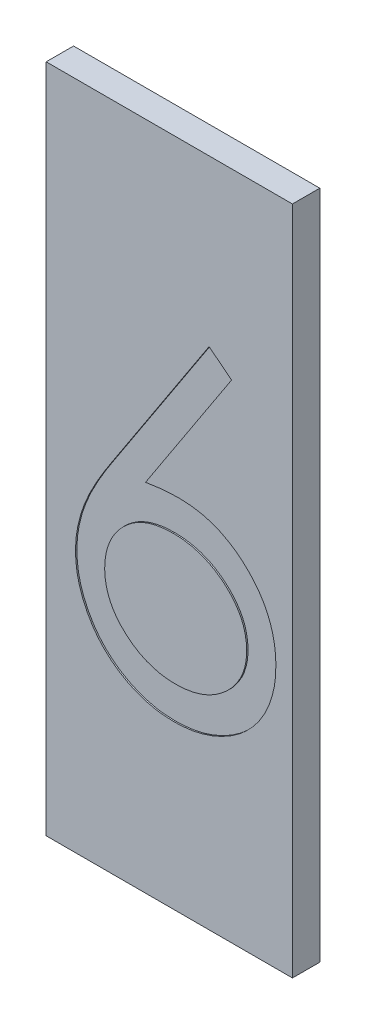
ISO-10303-21;
HEADER;
FILE_DESCRIPTION(('STEP AP214'),'2;1');
FILE_NAME('part.step','',(''),(''),'','','');
FILE_SCHEMA(('AUTOMOTIVE_DESIGN { 1 0 10303 214 1 1 1 1 }'));
ENDSEC;
DATA;
#1=APPLICATION_CONTEXT('core data for automotive mechanical design processes');
#2=APPLICATION_PROTOCOL_DEFINITION('international standard','automotive_design',2000,#1);
#3=PRODUCT_CONTEXT('',#1,'mechanical');
#4=PRODUCT('Part','Part','',(#3));
#5=PRODUCT_RELATED_PRODUCT_CATEGORY('part','',(#4));
#6=PRODUCT_DEFINITION_FORMATION('','',#4);
#7=PRODUCT_DEFINITION_CONTEXT('part definition',#1,'design');
#8=PRODUCT_DEFINITION('design','',#6,#7);
#9=PRODUCT_DEFINITION_SHAPE('','',#8);
#10=(LENGTH_UNIT() NAMED_UNIT(*) SI_UNIT(.MILLI.,.METRE.));
#11=(NAMED_UNIT(*) PLANE_ANGLE_UNIT() SI_UNIT($,.RADIAN.));
#12=(NAMED_UNIT(*) SI_UNIT($,.STERADIAN.) SOLID_ANGLE_UNIT());
#13=UNCERTAINTY_MEASURE_WITH_UNIT(LENGTH_MEASURE(1.E-05),#10,'distance_accuracy_value','');
#14=(GEOMETRIC_REPRESENTATION_CONTEXT(3) GLOBAL_UNCERTAINTY_ASSIGNED_CONTEXT((#13)) GLOBAL_UNIT_ASSIGNED_CONTEXT((#10,
#11,#12)) REPRESENTATION_CONTEXT('',''));
#15=CARTESIAN_POINT('',(0.,0.,0.));
#16=DIRECTION('',(0.,0.,1.));
#17=DIRECTION('',(1.,0.,0.));
#18=AXIS2_PLACEMENT_3D('',#15,#16,#17);
#19=CARTESIAN_POINT('',(0.,0.,2.));
#20=DIRECTION('',(0.,0.,1.));
#21=DIRECTION('',(1.,0.,0.));
#22=AXIS2_PLACEMENT_3D('',#19,#20,#21);
#23=PLANE('',#22);
#24=DIRECTION('',(0.,-1.,0.));
#25=VECTOR('',#24,1.);
#26=CARTESIAN_POINT('',(0.,0.,2.));
#27=LINE('',#26,#25);
#28=CARTESIAN_POINT('',(0.,49.,2.));
#29=VERTEX_POINT('',#28);
#30=CARTESIAN_POINT('',(0.,0.,2.));
#31=VERTEX_POINT('',#30);
#32=EDGE_CURVE('E282',#29,#31,#27,.T.);
#33=ORIENTED_EDGE('',*,*,#32,.T.);
#34=DIRECTION('',(1.,0.,0.));
#35=VECTOR('',#34,1.);
#36=CARTESIAN_POINT('',(18.,0.,2.));
#37=LINE('',#36,#35);
#38=CARTESIAN_POINT('',(18.,0.,2.));
#39=VERTEX_POINT('',#38);
#40=EDGE_CURVE('E285',#31,#39,#37,.T.);
#41=ORIENTED_EDGE('',*,*,#40,.T.);
#42=DIRECTION('',(0.,1.,0.));
#43=VECTOR('',#42,1.);
#44=CARTESIAN_POINT('',(18.,0.,2.));
#45=LINE('',#44,#43);
#46=CARTESIAN_POINT('',(18.,49.,2.));
#47=VERTEX_POINT('',#46);
#48=EDGE_CURVE('E288',#39,#47,#45,.T.);
#49=ORIENTED_EDGE('',*,*,#48,.T.);
#50=DIRECTION('',(-1.,0.,0.));
#51=VECTOR('',#50,1.);
#52=CARTESIAN_POINT('',(18.,49.,2.));
#53=LINE('',#52,#51);
#54=EDGE_CURVE('E290',#47,#29,#53,.T.);
#55=ORIENTED_EDGE('',*,*,#54,.T.);
#56=EDGE_LOOP('',(#33,#41,#49,#55));
#57=FACE_BOUND('',#56,.T.);
#58=CARTESIAN_POINT('',(2.13701923076923,19.1400240384615,2.));
#59=CARTESIAN_POINT('',(2.14505727626029,19.385255934943,2.));
#60=CARTESIAN_POINT('',(2.1614694293508,19.8859726119271,2.));
#61=CARTESIAN_POINT('',(2.27606463861702,20.6443260877571,2.));
#62=CARTESIAN_POINT('',(2.46020190312487,21.4202807687899,2.));
#63=CARTESIAN_POINT('',(2.66641982920136,22.0785548359355,2.));
#64=CARTESIAN_POINT('',(2.88430835468672,22.6178162621249,2.));
#65=CARTESIAN_POINT('',(3.06564081152372,23.052588225122,2.));
#66=CARTESIAN_POINT('',(3.29134246315642,23.4999983840939,2.));
#67=CARTESIAN_POINT('',(3.53200778878687,23.9753886574602,2.));
#68=CARTESIAN_POINT('',(3.8093000576511,24.466507404859,2.));
#69=CARTESIAN_POINT('',(4.1108047436682,24.9815627274443,2.));
#70=CARTESIAN_POINT('',(4.44485772572192,25.5123632710015,2.));
#71=CARTESIAN_POINT('',(4.67903776154775,25.8725728850918,2.));
#72=CARTESIAN_POINT('',(4.79875300480769,26.0567157451923,2.));
#73=B_SPLINE_CURVE_WITH_KNOTS('',3,(#58,#59,#60,#61,#62,#63,#64,#65,#66,#67,#68,#69,#70,#71,
#72),.UNSPECIFIED.,.F.,.F.,(4,1,1,1,1,1,1,1,1,1,1,1,4),(0.,0.0978181896147144,0.199726053401827,
0.305276357477941,0.415811490538292,0.47447223114356,0.537273879776098,0.603657420559656,
0.674298863090126,0.749834485316229,0.828598476757102,0.912377778157781,1.),.UNSPECIFIED.);
#74=CARTESIAN_POINT('',(2.13701923076923,19.1400240384615,2.));
#75=VERTEX_POINT('',#74);
#76=CARTESIAN_POINT('',(4.79875300480769,26.0567157451923,2.));
#77=VERTEX_POINT('',#76);
#78=EDGE_CURVE('E254',#75,#77,#73,.T.);
#79=ORIENTED_EDGE('',*,*,#78,.T.);
#80=DIRECTION('',(0.547387929885783,0.836878996160949,0.));
#81=VECTOR('',#80,1.);
#82=CARTESIAN_POINT('',(4.79875300480769,26.0567157451923,2.));
#83=LINE('',#82,#81);
#84=CARTESIAN_POINT('',(11.90625,36.9230769230769,2.));
#85=VERTEX_POINT('',#84);
#86=EDGE_CURVE('E48',#77,#85,#83,.T.);
#87=ORIENTED_EDGE('',*,*,#86,.T.);
#88=DIRECTION('',(0.786397428722927,-0.617720878793949,0.));
#89=VECTOR('',#88,1.);
#90=CARTESIAN_POINT('',(11.90625,36.9230769230769,2.));
#91=LINE('',#90,#89);
#92=CARTESIAN_POINT('',(13.5519456129808,35.63037109375,2.));
#93=VERTEX_POINT('',#92);
#94=EDGE_CURVE('E219',#85,#93,#91,.T.);
#95=ORIENTED_EDGE('',*,*,#94,.T.);
#96=DIRECTION('',(-0.547305260353809,-0.836933063027773,0.));
#97=VECTOR('',#96,1.);
#98=CARTESIAN_POINT('',(13.5519456129808,35.63037109375,2.));
#99=LINE('',#98,#97);
#100=CARTESIAN_POINT('',(7.26014122596154,26.0090144230769,2.));
#101=VERTEX_POINT('',#100);
#102=EDGE_CURVE('E222',#93,#101,#99,.T.);
#103=ORIENTED_EDGE('',*,*,#102,.T.);
#104=CARTESIAN_POINT('',(7.26014122596154,26.0090144230769,2.));
#105=CARTESIAN_POINT('',(7.67903900329456,26.0757837250237,2.));
#106=CARTESIAN_POINT('',(8.49614648118071,26.206024797825,2.));
#107=CARTESIAN_POINT('',(9.32322875506985,26.2275101052509,2.));
#108=CARTESIAN_POINT('',(9.72629957932693,26.2379807692308,2.));
#109=B_SPLINE_CURVE_WITH_KNOTS('',3,(#104,#105,#106,#107,#108),.UNSPECIFIED.,.F.,.F.,(4,1,4),
(0.,0.512659336341781,1.),.UNSPECIFIED.);
#110=CARTESIAN_POINT('',(9.72629957932693,26.2379807692308,2.));
#111=VERTEX_POINT('',#110);
#112=EDGE_CURVE('E225',#101,#111,#109,.T.);
#113=ORIENTED_EDGE('',*,*,#112,.T.);
#114=CARTESIAN_POINT('',(9.72629957932692,26.2379807692308,2.));
#115=CARTESIAN_POINT('',(9.9683195990358,26.2314757950149,2.));
#116=CARTESIAN_POINT('',(10.4447288057093,26.2186709468484,2.));
#117=CARTESIAN_POINT('',(11.1441822276431,26.1201290341057,2.));
#118=CARTESIAN_POINT('',(11.8162998098892,25.9648367547682,2.));
#119=CARTESIAN_POINT('',(12.458295778984,25.7384665848349,2.));
#120=CARTESIAN_POINT('',(13.0724744591357,25.4492987810486,2.));
#121=CARTESIAN_POINT('',(13.6623604040884,25.1027325386045,2.));
#122=CARTESIAN_POINT('',(14.2168651514182,24.6808724633202,2.));
#123=CARTESIAN_POINT('',(14.7431294242706,24.2096233891478,2.));
#124=CARTESIAN_POINT('',(15.2209244976048,23.6876739053505,2.));
#125=CARTESIAN_POINT('',(15.6439437327372,23.1338540966897,2.));
#126=CARTESIAN_POINT('',(15.9992724407854,22.5487409598984,2.));
#127=CARTESIAN_POINT('',(16.2875664431989,21.9326308541734,2.));
#128=CARTESIAN_POINT('',(16.5114371350881,21.2864734989491,2.));
#129=CARTESIAN_POINT('',(16.6746387915454,20.6110956213583,2.));
#130=CARTESIAN_POINT('',(16.7711106641233,19.9060315030314,2.));
#131=CARTESIAN_POINT('',(16.7842108777385,19.4265282034526,2.));
#132=CARTESIAN_POINT('',(16.7908653846154,19.1829552283654,2.));
#133=B_SPLINE_CURVE_WITH_KNOTS('',3,(#114,#115,#116,#117,#118,#119,#120,#121,#122,#123,#124,
#125,#126,#127,#128,#129,#130,#131,#132),.UNSPECIFIED.,.F.,.F.,(4,1,1,1,1,1,1,1,1,1,1,1,1,1,1,1,
4),(0.,0.0652308037420294,0.128404896003223,0.190067071596478,0.25094336576828,
0.311545832852143,0.372862802156829,0.435023673856238,0.499071724707043,0.563091075049662,
0.625510106330375,0.686680035929649,0.747282503013512,0.808563495215959,0.870742103515985,
0.934340951505912,1.),.UNSPECIFIED.);
#134=CARTESIAN_POINT('',(16.7908653846154,19.1829552283654,2.));
#135=VERTEX_POINT('',#134);
#136=EDGE_CURVE('E230',#111,#135,#133,.T.);
#137=ORIENTED_EDGE('',*,*,#136,.T.);
#138=CARTESIAN_POINT('',(16.7908653846154,19.1829552283654,2.));
#139=CARTESIAN_POINT('',(16.7811831888853,18.8497183140129,2.));
#140=CARTESIAN_POINT('',(16.762130919053,18.1939869295885,2.));
#141=CARTESIAN_POINT('',(16.5722854496981,17.2389239806579,2.));
#142=CARTESIAN_POINT('',(16.2772850094877,16.3290652589061,2.));
#143=CARTESIAN_POINT('',(15.8556164680306,15.4789374322748,2.));
#144=CARTESIAN_POINT('',(15.3318613266591,14.6897056642524,2.));
#145=CARTESIAN_POINT('',(14.6931584194015,13.9903974084369,2.));
#146=CARTESIAN_POINT('',(13.9621589719857,13.3667137616876,2.));
#147=CARTESIAN_POINT('',(13.1356148629397,12.8451749774337,2.));
#148=CARTESIAN_POINT('',(12.246095767791,12.4192506482241,2.));
#149=CARTESIAN_POINT('',(11.3116116425255,12.1133264119102,2.));
#150=CARTESIAN_POINT('',(10.3412376647535,11.9249799505184,2.));
#151=CARTESIAN_POINT('',(9.68262059923948,11.9013674573714,2.));
#152=CARTESIAN_POINT('',(9.34945913461539,11.8894230769231,2.));
#153=B_SPLINE_CURVE_WITH_KNOTS('',3,(#138,#139,#140,#141,#142,#143,#144,#145,#146,#147,#148,
#149,#150,#151,#152),.UNSPECIFIED.,.F.,.F.,(4,1,1,1,1,1,1,1,1,1,1,1,4),(0.,0.0859479431441278,
0.169125211880691,0.25039910718605,0.332289736138836,0.413364287915881,0.494172283371189,
0.576021735386637,0.660756969254007,0.745783125913743,0.830043592975224,0.914027545820683,1.),.UNSPECIFIED.);
#154=CARTESIAN_POINT('',(9.34945913461539,11.8894230769231,2.));
#155=VERTEX_POINT('',#154);
#156=EDGE_CURVE('E238',#135,#155,#153,.T.);
#157=ORIENTED_EDGE('',*,*,#156,.T.);
#158=CARTESIAN_POINT('',(9.34945913461539,11.8894230769231,2.));
#159=CARTESIAN_POINT('',(9.02903336767536,11.8998203338581,2.));
#160=CARTESIAN_POINT('',(8.39432602551729,11.9204154794294,2.));
#161=CARTESIAN_POINT('',(7.46065290757996,12.1038801638961,2.));
#162=CARTESIAN_POINT('',(6.56351345031093,12.4012445595191,2.));
#163=CARTESIAN_POINT('',(5.70919319806236,12.8109167046056,2.));
#164=CARTESIAN_POINT('',(4.91779759939207,13.3283819439784,2.));
#165=CARTESIAN_POINT('',(4.20977960866337,13.9513324502154,2.));
#166=CARTESIAN_POINT('',(3.58866949961299,14.6664522036546,2.));
#167=CARTESIAN_POINT('',(3.07177073935221,15.4736302806295,2.));
#168=CARTESIAN_POINT('',(2.6617961523542,16.3410173129363,2.));
#169=CARTESIAN_POINT('',(2.35434326897368,17.2454647519438,2.));
#170=CARTESIAN_POINT('',(2.17475454267769,18.1836771276141,2.));
#171=CARTESIAN_POINT('',(2.14965918271041,18.8196827352936,2.));
#172=CARTESIAN_POINT('',(2.13701923076923,19.1400240384615,2.));
#173=B_SPLINE_CURVE_WITH_KNOTS('',3,(#158,#159,#160,#161,#162,#163,#164,#165,#166,#167,#168,
#169,#170,#171,#172),.UNSPECIFIED.,.F.,.F.,(4,1,1,1,1,1,1,1,1,1,1,1,4),(0.,0.0843347219926269,
0.167052318416074,0.249566077240966,0.332740481801846,0.415914886362727,0.497828009539996,
0.580372588608051,0.664600121056503,0.749466693112617,0.832510233940141,0.915639281668174,1.),.UNSPECIFIED.);
#174=EDGE_CURVE('E246',#155,#75,#173,.T.);
#175=ORIENTED_EDGE('',*,*,#174,.T.);
#176=EDGE_LOOP('',(#79,#87,#95,#103,#113,#137,#157,#175));
#177=FACE_BOUND('',#176,.T.);
#178=ADVANCED_FACE('F33',(#57,#177),#23,.T.);
#179=CARTESIAN_POINT('',(0.,0.,2.));
#180=DIRECTION('',(1.,0.,0.));
#181=DIRECTION('',(0.,0.,-1.));
#182=AXIS2_PLACEMENT_3D('',#179,#180,#181);
#183=PLANE('',#182);
#184=DIRECTION('',(0.,-1.,0.));
#185=VECTOR('',#184,1.);
#186=CARTESIAN_POINT('',(0.,0.,0.));
#187=LINE('',#186,#185);
#188=CARTESIAN_POINT('',(0.,49.,0.));
#189=VERTEX_POINT('',#188);
#190=CARTESIAN_POINT('',(0.,0.,0.));
#191=VERTEX_POINT('',#190);
#192=EDGE_CURVE('E281',#189,#191,#187,.T.);
#193=ORIENTED_EDGE('',*,*,#192,.T.);
#194=DIRECTION('',(0.,0.,-1.));
#195=VECTOR('',#194,1.);
#196=CARTESIAN_POINT('',(0.,0.,2.));
#197=LINE('',#196,#195);
#198=EDGE_CURVE('E11',#31,#191,#197,.T.);
#199=ORIENTED_EDGE('',*,*,#198,.F.);
#200=ORIENTED_EDGE('',*,*,#32,.F.);
#201=DIRECTION('',(0.,0.,-1.));
#202=VECTOR('',#201,1.);
#203=CARTESIAN_POINT('',(0.,49.,2.));
#204=LINE('',#203,#202);
#205=EDGE_CURVE('E292',#29,#189,#204,.T.);
#206=ORIENTED_EDGE('',*,*,#205,.T.);
#207=EDGE_LOOP('',(#193,#199,#200,#206));
#208=FACE_BOUND('',#207,.T.);
#209=ADVANCED_FACE('F35',(#208),#183,.F.);
#210=CARTESIAN_POINT('',(18.,0.,2.));
#211=DIRECTION('',(0.,1.,0.));
#212=DIRECTION('',(0.,0.,1.));
#213=AXIS2_PLACEMENT_3D('',#210,#211,#212);
#214=PLANE('',#213);
#215=DIRECTION('',(1.,0.,0.));
#216=VECTOR('',#215,1.);
#217=CARTESIAN_POINT('',(18.,0.,0.));
#218=LINE('',#217,#216);
#219=CARTESIAN_POINT('',(18.,0.,0.));
#220=VERTEX_POINT('',#219);
#221=EDGE_CURVE('E295',#191,#220,#218,.T.);
#222=ORIENTED_EDGE('',*,*,#221,.T.);
#223=DIRECTION('',(0.,0.,-1.));
#224=VECTOR('',#223,1.);
#225=CARTESIAN_POINT('',(18.,0.,2.));
#226=LINE('',#225,#224);
#227=EDGE_CURVE('E41',#39,#220,#226,.T.);
#228=ORIENTED_EDGE('',*,*,#227,.F.);
#229=ORIENTED_EDGE('',*,*,#40,.F.);
#230=ORIENTED_EDGE('',*,*,#198,.T.);
#231=EDGE_LOOP('',(#222,#228,#229,#230));
#232=FACE_BOUND('',#231,.T.);
#233=ADVANCED_FACE('F325',(#232),#214,.F.);
#234=CARTESIAN_POINT('',(18.,0.,2.));
#235=DIRECTION('',(-1.,0.,0.));
#236=DIRECTION('',(0.,0.,1.));
#237=AXIS2_PLACEMENT_3D('',#234,#235,#236);
#238=PLANE('',#237);
#239=DIRECTION('',(0.,1.,0.));
#240=VECTOR('',#239,1.);
#241=CARTESIAN_POINT('',(18.,0.,0.));
#242=LINE('',#241,#240);
#243=CARTESIAN_POINT('',(18.,49.,0.));
#244=VERTEX_POINT('',#243);
#245=EDGE_CURVE('E297',#220,#244,#242,.T.);
#246=ORIENTED_EDGE('',*,*,#245,.T.);
#247=DIRECTION('',(0.,0.,-1.));
#248=VECTOR('',#247,1.);
#249=CARTESIAN_POINT('',(18.,49.,2.));
#250=LINE('',#249,#248);
#251=EDGE_CURVE('E302',#47,#244,#250,.T.);
#252=ORIENTED_EDGE('',*,*,#251,.F.);
#253=ORIENTED_EDGE('',*,*,#48,.F.);
#254=ORIENTED_EDGE('',*,*,#227,.T.);
#255=EDGE_LOOP('',(#246,#252,#253,#254));
#256=FACE_BOUND('',#255,.T.);
#257=ADVANCED_FACE('F309',(#256),#238,.F.);
#258=CARTESIAN_POINT('',(18.,49.,2.));
#259=DIRECTION('',(0.,-1.,0.));
#260=DIRECTION('',(0.,0.,-1.));
#261=AXIS2_PLACEMENT_3D('',#258,#259,#260);
#262=PLANE('',#261);
#263=DIRECTION('',(-1.,0.,0.));
#264=VECTOR('',#263,1.);
#265=CARTESIAN_POINT('',(18.,49.,0.));
#266=LINE('',#265,#264);
#267=EDGE_CURVE('E286',#244,#189,#266,.T.);
#268=ORIENTED_EDGE('',*,*,#267,.T.);
#269=ORIENTED_EDGE('',*,*,#205,.F.);
#270=ORIENTED_EDGE('',*,*,#54,.F.);
#271=ORIENTED_EDGE('',*,*,#251,.T.);
#272=EDGE_LOOP('',(#268,#269,#270,#271));
#273=FACE_BOUND('',#272,.T.);
#274=ADVANCED_FACE('F318',(#273),#262,.F.);
#275=CARTESIAN_POINT('',(0.,0.,0.));
#276=DIRECTION('',(0.,0.,1.));
#277=DIRECTION('',(1.,0.,0.));
#278=AXIS2_PLACEMENT_3D('',#275,#276,#277);
#279=PLANE('',#278);
#280=ORIENTED_EDGE('',*,*,#192,.F.);
#281=ORIENTED_EDGE('',*,*,#267,.F.);
#282=ORIENTED_EDGE('',*,*,#245,.F.);
#283=ORIENTED_EDGE('',*,*,#221,.F.);
#284=EDGE_LOOP('',(#280,#281,#282,#283));
#285=FACE_BOUND('',#284,.T.);
#286=ADVANCED_FACE('F315',(#285),#279,.F.);
#287=CARTESIAN_POINT('',(4.79875300480769,26.0567157451923,1.9));
#288=DIRECTION('',(0.836878996160949,-0.547387929885783,0.));
#289=DIRECTION('',(0.547387929885783,0.836878996160949,0.));
#290=AXIS2_PLACEMENT_3D('',#287,#288,#289);
#291=PLANE('',#290);
#292=ORIENTED_EDGE('',*,*,#86,.F.);
#293=DIRECTION('',(0.,0.,1.));
#294=VECTOR('',#293,1.);
#295=CARTESIAN_POINT('',(4.79875300480769,26.0567157451923,1.9));
#296=LINE('',#295,#294);
#297=CARTESIAN_POINT('',(4.79875300480769,26.0567157451923,1.9));
#298=VERTEX_POINT('',#297);
#299=EDGE_CURVE('E209',#298,#77,#296,.T.);
#300=ORIENTED_EDGE('',*,*,#299,.F.);
#301=DIRECTION('',(0.547387929885783,0.836878996160949,0.));
#302=VECTOR('',#301,1.);
#303=CARTESIAN_POINT('',(4.79875300480769,26.0567157451923,1.9));
#304=LINE('',#303,#302);
#305=CARTESIAN_POINT('',(11.90625,36.9230769230769,1.9));
#306=VERTEX_POINT('',#305);
#307=EDGE_CURVE('E262',#298,#306,#304,.T.);
#308=ORIENTED_EDGE('',*,*,#307,.T.);
#309=DIRECTION('',(0.,0.,1.));
#310=VECTOR('',#309,1.);
#311=CARTESIAN_POINT('',(11.90625,36.9230769230769,1.9));
#312=LINE('',#311,#310);
#313=EDGE_CURVE('E279',#306,#85,#312,.T.);
#314=ORIENTED_EDGE('',*,*,#313,.T.);
#315=EDGE_LOOP('',(#292,#300,#308,#314));
#316=FACE_BOUND('',#315,.T.);
#317=ADVANCED_FACE('F411',(#316),#291,.T.);
#318=CARTESIAN_POINT('',(11.90625,36.9230769230769,1.9));
#319=DIRECTION('',(-0.617720878793949,-0.786397428722927,0.));
#320=DIRECTION('',(0.786397428722927,-0.617720878793949,0.));
#321=AXIS2_PLACEMENT_3D('',#318,#319,#320);
#322=PLANE('',#321);
#323=ORIENTED_EDGE('',*,*,#94,.F.);
#324=ORIENTED_EDGE('',*,*,#313,.F.);
#325=DIRECTION('',(0.786397428722927,-0.617720878793949,0.));
#326=VECTOR('',#325,1.);
#327=CARTESIAN_POINT('',(11.90625,36.9230769230769,1.9));
#328=LINE('',#327,#326);
#329=CARTESIAN_POINT('',(13.5519456129808,35.63037109375,1.9));
#330=VERTEX_POINT('',#329);
#331=EDGE_CURVE('E382',#306,#330,#328,.T.);
#332=ORIENTED_EDGE('',*,*,#331,.T.);
#333=DIRECTION('',(0.,0.,1.));
#334=VECTOR('',#333,1.);
#335=CARTESIAN_POINT('',(13.5519456129808,35.63037109375,1.9));
#336=LINE('',#335,#334);
#337=EDGE_CURVE('E277',#330,#93,#336,.T.);
#338=ORIENTED_EDGE('',*,*,#337,.T.);
#339=EDGE_LOOP('',(#323,#324,#332,#338));
#340=FACE_BOUND('',#339,.T.);
#341=ADVANCED_FACE('F408',(#340),#322,.T.);
#342=CARTESIAN_POINT('',(13.5519456129808,35.63037109375,1.9));
#343=DIRECTION('',(-0.836933063027773,0.547305260353809,0.));
#344=DIRECTION('',(-0.547305260353809,-0.836933063027773,0.));
#345=AXIS2_PLACEMENT_3D('',#342,#343,#344);
#346=PLANE('',#345);
#347=ORIENTED_EDGE('',*,*,#102,.F.);
#348=ORIENTED_EDGE('',*,*,#337,.F.);
#349=DIRECTION('',(-0.547305260353809,-0.836933063027773,0.));
#350=VECTOR('',#349,1.);
#351=CARTESIAN_POINT('',(13.5519456129808,35.63037109375,1.9));
#352=LINE('',#351,#350);
#353=CARTESIAN_POINT('',(7.26014122596154,26.0090144230769,1.9));
#354=VERTEX_POINT('',#353);
#355=EDGE_CURVE('E384',#330,#354,#352,.T.);
#356=ORIENTED_EDGE('',*,*,#355,.T.);
#357=DIRECTION('',(0.,0.,1.));
#358=VECTOR('',#357,1.);
#359=CARTESIAN_POINT('',(7.26014122596154,26.0090144230769,1.9));
#360=LINE('',#359,#358);
#361=EDGE_CURVE('E275',#354,#101,#360,.T.);
#362=ORIENTED_EDGE('',*,*,#361,.T.);
#363=EDGE_LOOP('',(#347,#348,#356,#362));
#364=FACE_BOUND('',#363,.T.);
#365=ADVANCED_FACE('F404',(#364),#346,.T.);
#366=CARTESIAN_POINT('',(7.26014122596154,26.0090144230769,1.9));
#367=CARTESIAN_POINT('',(7.67903900329456,26.0757837250237,1.9));
#368=CARTESIAN_POINT('',(8.49614648118071,26.206024797825,1.9));
#369=CARTESIAN_POINT('',(9.32322875506985,26.2275101052509,1.9));
#370=CARTESIAN_POINT('',(9.72629957932693,26.2379807692308,1.9));
#371=B_SPLINE_CURVE_WITH_KNOTS('',3,(#366,#367,#368,#369,#370),.UNSPECIFIED.,.F.,.F.,(4,1,4),
(0.,0.512659336341781,1.),.UNSPECIFIED.);
#372=DIRECTION('',(0.,0.,1.));
#373=VECTOR('',#372,1.);
#374=SURFACE_OF_LINEAR_EXTRUSION('',#371,#373);
#375=ORIENTED_EDGE('',*,*,#112,.F.);
#376=ORIENTED_EDGE('',*,*,#361,.F.);
#377=CARTESIAN_POINT('',(9.72629957932693,26.2379807692308,1.9));
#378=VERTEX_POINT('',#377);
#379=EDGE_CURVE('E386',#354,#378,#371,.T.);
#380=ORIENTED_EDGE('',*,*,#379,.T.);
#381=DIRECTION('',(0.,0.,1.));
#382=VECTOR('',#381,1.);
#383=CARTESIAN_POINT('',(9.72629957932693,26.2379807692308,1.9));
#384=LINE('',#383,#382);
#385=EDGE_CURVE('E273',#378,#111,#384,.T.);
#386=ORIENTED_EDGE('',*,*,#385,.T.);
#387=EDGE_LOOP('',(#375,#376,#380,#386));
#388=FACE_BOUND('',#387,.T.);
#389=ADVANCED_FACE('F399',(#388),#374,.T.);
#390=CARTESIAN_POINT('',(9.72629957932692,26.2379807692308,1.9));
#391=CARTESIAN_POINT('',(9.9683195990358,26.2314757950149,1.9));
#392=CARTESIAN_POINT('',(10.4447288057093,26.2186709468484,1.9));
#393=CARTESIAN_POINT('',(11.1441822276431,26.1201290341057,1.9));
#394=CARTESIAN_POINT('',(11.8162998098892,25.9648367547682,1.9));
#395=CARTESIAN_POINT('',(12.458295778984,25.7384665848349,1.9));
#396=CARTESIAN_POINT('',(13.0724744591357,25.4492987810486,1.9));
#397=CARTESIAN_POINT('',(13.6623604040884,25.1027325386045,1.9));
#398=CARTESIAN_POINT('',(14.2168651514182,24.6808724633202,1.9));
#399=CARTESIAN_POINT('',(14.7431294242706,24.2096233891478,1.9));
#400=CARTESIAN_POINT('',(15.2209244976048,23.6876739053505,1.9));
#401=CARTESIAN_POINT('',(15.6439437327372,23.1338540966897,1.9));
#402=CARTESIAN_POINT('',(15.9992724407854,22.5487409598984,1.9));
#403=CARTESIAN_POINT('',(16.2875664431989,21.9326308541734,1.9));
#404=CARTESIAN_POINT('',(16.5114371350881,21.2864734989491,1.9));
#405=CARTESIAN_POINT('',(16.6746387915454,20.6110956213583,1.9));
#406=CARTESIAN_POINT('',(16.7711106641233,19.9060315030314,1.9));
#407=CARTESIAN_POINT('',(16.7842108777385,19.4265282034526,1.9));
#408=CARTESIAN_POINT('',(16.7908653846154,19.1829552283654,1.9));
#409=B_SPLINE_CURVE_WITH_KNOTS('',3,(#390,#391,#392,#393,#394,#395,#396,#397,#398,#399,#400,
#401,#402,#403,#404,#405,#406,#407,#408),.UNSPECIFIED.,.F.,.F.,(4,1,1,1,1,1,1,1,1,1,1,1,1,1,1,1,
4),(0.,0.0652308037420294,0.128404896003223,0.190067071596478,0.25094336576828,
0.311545832852143,0.372862802156829,0.435023673856238,0.499071724707043,0.563091075049662,
0.625510106330375,0.686680035929649,0.747282503013512,0.808563495215959,0.870742103515985,
0.934340951505912,1.),.UNSPECIFIED.);
#410=DIRECTION('',(0.,0.,1.));
#411=VECTOR('',#410,1.);
#412=SURFACE_OF_LINEAR_EXTRUSION('',#409,#411);
#413=ORIENTED_EDGE('',*,*,#136,.F.);
#414=ORIENTED_EDGE('',*,*,#385,.F.);
#415=CARTESIAN_POINT('',(16.7908653846154,19.1829552283654,1.9));
#416=VERTEX_POINT('',#415);
#417=EDGE_CURVE('E391',#378,#416,#409,.T.);
#418=ORIENTED_EDGE('',*,*,#417,.T.);
#419=DIRECTION('',(0.,0.,1.));
#420=VECTOR('',#419,1.);
#421=CARTESIAN_POINT('',(16.7908653846154,19.1829552283654,1.9));
#422=LINE('',#421,#420);
#423=EDGE_CURVE('E271',#416,#135,#422,.T.);
#424=ORIENTED_EDGE('',*,*,#423,.T.);
#425=EDGE_LOOP('',(#413,#414,#418,#424));
#426=FACE_BOUND('',#425,.T.);
#427=ADVANCED_FACE('F403',(#426),#412,.T.);
#428=CARTESIAN_POINT('',(16.7908653846154,19.1829552283654,1.9));
#429=CARTESIAN_POINT('',(16.7811831888853,18.8497183140129,1.9));
#430=CARTESIAN_POINT('',(16.762130919053,18.1939869295885,1.9));
#431=CARTESIAN_POINT('',(16.5722854496981,17.2389239806579,1.9));
#432=CARTESIAN_POINT('',(16.2772850094877,16.3290652589061,1.9));
#433=CARTESIAN_POINT('',(15.8556164680306,15.4789374322748,1.9));
#434=CARTESIAN_POINT('',(15.3318613266591,14.6897056642524,1.9));
#435=CARTESIAN_POINT('',(14.6931584194015,13.9903974084369,1.9));
#436=CARTESIAN_POINT('',(13.9621589719857,13.3667137616876,1.9));
#437=CARTESIAN_POINT('',(13.1356148629397,12.8451749774337,1.9));
#438=CARTESIAN_POINT('',(12.246095767791,12.4192506482241,1.9));
#439=CARTESIAN_POINT('',(11.3116116425255,12.1133264119102,1.9));
#440=CARTESIAN_POINT('',(10.3412376647535,11.9249799505184,1.9));
#441=CARTESIAN_POINT('',(9.68262059923948,11.9013674573714,1.9));
#442=CARTESIAN_POINT('',(9.34945913461539,11.8894230769231,1.9));
#443=B_SPLINE_CURVE_WITH_KNOTS('',3,(#428,#429,#430,#431,#432,#433,#434,#435,#436,#437,#438,
#439,#440,#441,#442),.UNSPECIFIED.,.F.,.F.,(4,1,1,1,1,1,1,1,1,1,1,1,4),(0.,0.0859479431441278,
0.169125211880691,0.25039910718605,0.332289736138836,0.413364287915881,0.494172283371189,
0.576021735386637,0.660756969254007,0.745783125913743,0.830043592975224,0.914027545820683,1.),.UNSPECIFIED.);
#444=DIRECTION('',(0.,0.,1.));
#445=VECTOR('',#444,1.);
#446=SURFACE_OF_LINEAR_EXTRUSION('',#443,#445);
#447=ORIENTED_EDGE('',*,*,#156,.F.);
#448=ORIENTED_EDGE('',*,*,#423,.F.);
#449=CARTESIAN_POINT('',(9.34945913461539,11.8894230769231,1.9));
#450=VERTEX_POINT('',#449);
#451=EDGE_CURVE('E559',#416,#450,#443,.T.);
#452=ORIENTED_EDGE('',*,*,#451,.T.);
#453=DIRECTION('',(0.,0.,1.));
#454=VECTOR('',#453,1.);
#455=CARTESIAN_POINT('',(9.34945913461539,11.8894230769231,1.9));
#456=LINE('',#455,#454);
#457=EDGE_CURVE('E269',#450,#155,#456,.T.);
#458=ORIENTED_EDGE('',*,*,#457,.T.);
#459=EDGE_LOOP('',(#447,#448,#452,#458));
#460=FACE_BOUND('',#459,.T.);
#461=ADVANCED_FACE('F481',(#460),#446,.T.);
#462=CARTESIAN_POINT('',(9.34945913461539,11.8894230769231,1.9));
#463=CARTESIAN_POINT('',(9.02903336767536,11.8998203338581,1.9));
#464=CARTESIAN_POINT('',(8.39432602551729,11.9204154794294,1.9));
#465=CARTESIAN_POINT('',(7.46065290757996,12.1038801638961,1.9));
#466=CARTESIAN_POINT('',(6.56351345031093,12.4012445595191,1.9));
#467=CARTESIAN_POINT('',(5.70919319806236,12.8109167046056,1.9));
#468=CARTESIAN_POINT('',(4.91779759939207,13.3283819439784,1.9));
#469=CARTESIAN_POINT('',(4.20977960866337,13.9513324502154,1.9));
#470=CARTESIAN_POINT('',(3.58866949961299,14.6664522036546,1.9));
#471=CARTESIAN_POINT('',(3.07177073935221,15.4736302806295,1.9));
#472=CARTESIAN_POINT('',(2.6617961523542,16.3410173129363,1.9));
#473=CARTESIAN_POINT('',(2.35434326897368,17.2454647519438,1.9));
#474=CARTESIAN_POINT('',(2.17475454267769,18.1836771276141,1.9));
#475=CARTESIAN_POINT('',(2.14965918271041,18.8196827352936,1.9));
#476=CARTESIAN_POINT('',(2.13701923076923,19.1400240384615,1.9));
#477=B_SPLINE_CURVE_WITH_KNOTS('',3,(#462,#463,#464,#465,#466,#467,#468,#469,#470,#471,#472,
#473,#474,#475,#476),.UNSPECIFIED.,.F.,.F.,(4,1,1,1,1,1,1,1,1,1,1,1,4),(0.,0.0843347219926269,
0.167052318416074,0.249566077240966,0.332740481801846,0.415914886362727,0.497828009539996,
0.580372588608051,0.664600121056503,0.749466693112617,0.832510233940141,0.915639281668174,1.),.UNSPECIFIED.);
#478=DIRECTION('',(0.,0.,1.));
#479=VECTOR('',#478,1.);
#480=SURFACE_OF_LINEAR_EXTRUSION('',#477,#479);
#481=ORIENTED_EDGE('',*,*,#174,.F.);
#482=ORIENTED_EDGE('',*,*,#457,.F.);
#483=CARTESIAN_POINT('',(2.13701923076923,19.1400240384615,1.9));
#484=VERTEX_POINT('',#483);
#485=EDGE_CURVE('E210',#450,#484,#477,.T.);
#486=ORIENTED_EDGE('',*,*,#485,.T.);
#487=DIRECTION('',(0.,0.,1.));
#488=VECTOR('',#487,1.);
#489=CARTESIAN_POINT('',(2.13701923076923,19.1400240384615,1.9));
#490=LINE('',#489,#488);
#491=EDGE_CURVE('E267',#484,#75,#490,.T.);
#492=ORIENTED_EDGE('',*,*,#491,.T.);
#493=EDGE_LOOP('',(#481,#482,#486,#492));
#494=FACE_BOUND('',#493,.T.);
#495=ADVANCED_FACE('F200',(#494),#480,.T.);
#496=CARTESIAN_POINT('',(2.13701923076923,19.1400240384615,1.9));
#497=CARTESIAN_POINT('',(2.14505727626029,19.385255934943,1.9));
#498=CARTESIAN_POINT('',(2.1614694293508,19.8859726119271,1.9));
#499=CARTESIAN_POINT('',(2.27606463861702,20.6443260877571,1.9));
#500=CARTESIAN_POINT('',(2.46020190312487,21.4202807687899,1.9));
#501=CARTESIAN_POINT('',(2.66641982920136,22.0785548359355,1.9));
#502=CARTESIAN_POINT('',(2.88430835468672,22.6178162621249,1.9));
#503=CARTESIAN_POINT('',(3.06564081152372,23.052588225122,1.9));
#504=CARTESIAN_POINT('',(3.29134246315642,23.4999983840939,1.9));
#505=CARTESIAN_POINT('',(3.53200778878687,23.9753886574602,1.9));
#506=CARTESIAN_POINT('',(3.8093000576511,24.466507404859,1.9));
#507=CARTESIAN_POINT('',(4.1108047436682,24.9815627274443,1.9));
#508=CARTESIAN_POINT('',(4.44485772572192,25.5123632710015,1.9));
#509=CARTESIAN_POINT('',(4.67903776154775,25.8725728850918,1.9));
#510=CARTESIAN_POINT('',(4.79875300480769,26.0567157451923,1.9));
#511=B_SPLINE_CURVE_WITH_KNOTS('',3,(#496,#497,#498,#499,#500,#501,#502,#503,#504,#505,#506,
#507,#508,#509,#510),.UNSPECIFIED.,.F.,.F.,(4,1,1,1,1,1,1,1,1,1,1,1,4),(0.,0.0978181896147144,
0.199726053401827,0.305276357477941,0.415811490538292,0.47447223114356,0.537273879776098,
0.603657420559656,0.674298863090126,0.749834485316229,0.828598476757102,0.912377778157781,1.),.UNSPECIFIED.);
#512=DIRECTION('',(0.,0.,1.));
#513=VECTOR('',#512,1.);
#514=SURFACE_OF_LINEAR_EXTRUSION('',#511,#513);
#515=ORIENTED_EDGE('',*,*,#78,.F.);
#516=ORIENTED_EDGE('',*,*,#491,.F.);
#517=EDGE_CURVE('E204',#484,#298,#511,.T.);
#518=ORIENTED_EDGE('',*,*,#517,.T.);
#519=ORIENTED_EDGE('',*,*,#299,.T.);
#520=EDGE_LOOP('',(#515,#516,#518,#519));
#521=FACE_BOUND('',#520,.T.);
#522=ADVANCED_FACE('F196',(#521),#514,.T.);
#523=CARTESIAN_POINT('',(8.48823456371783,26.1778584801576,1.9));
#524=DIRECTION('',(0.,0.,1.));
#525=DIRECTION('',(1.,0.,0.));
#526=AXIS2_PLACEMENT_3D('',#523,#524,#525);
#527=PLANE('',#526);
#528=CARTESIAN_POINT('',(9.46394230769231,14.3317307692308,1.9));
#529=CARTESIAN_POINT('',(9.64060043152525,14.3369634054993,1.9));
#530=CARTESIAN_POINT('',(9.9870509065586,14.347225312971,1.9));
#531=CARTESIAN_POINT('',(10.4984989127693,14.4089994884722,1.9));
#532=CARTESIAN_POINT('',(10.9888889020527,14.5182964681542,1.9));
#533=CARTESIAN_POINT('',(11.4586517551711,14.6735047801381,1.9));
#534=CARTESIAN_POINT('',(11.9113711343872,14.8630088025146,1.9));
#535=CARTESIAN_POINT('',(12.3407086146622,15.1027116850263,1.9));
#536=CARTESIAN_POINT('',(12.7491140368187,15.3881631290134,1.9));
#537=CARTESIAN_POINT('',(13.1352888301671,15.708750328189,1.9));
#538=CARTESIAN_POINT('',(13.4933875892243,16.0582691959363,1.9));
#539=CARTESIAN_POINT('',(13.8014347901219,16.4340285574475,1.9));
#540=CARTESIAN_POINT('',(14.064618930566,16.8265530952987,1.9));
#541=CARTESIAN_POINT('',(14.2784836675814,17.2361137389553,1.9));
#542=CARTESIAN_POINT('',(14.4489899531523,17.665619717332,1.9));
#543=CARTESIAN_POINT('',(14.5654770781478,18.1127281425662,1.9));
#544=CARTESIAN_POINT('',(14.6411959902924,18.5777660335056,1.9));
#545=CARTESIAN_POINT('',(14.6495736784652,18.8932634559254,1.9));
#546=CARTESIAN_POINT('',(14.6538461538462,19.0541616586538,1.9));
#547=B_SPLINE_CURVE_WITH_KNOTS('',3,(#528,#529,#530,#531,#532,#533,#534,#535,#536,#537,#538,
#539,#540,#541,#542,#543,#544,#545,#546),.UNSPECIFIED.,.F.,.F.,(4,1,1,1,1,1,1,1,1,1,1,1,1,1,1,1,
4),(0.,0.0679623714944555,0.133283402867522,0.197835297757055,0.260891986530987,
0.323376504483175,0.386350075469088,0.449637731051713,0.514795326978357,0.579239913241029,
0.641814177758288,0.701358564786059,0.76072676598572,0.819222067924388,0.87871616938463,
0.938147354053308,1.),.UNSPECIFIED.);
#548=CARTESIAN_POINT('',(9.46394230769231,14.3317307692308,1.9));
#549=VERTEX_POINT('',#548);
#550=CARTESIAN_POINT('',(14.6538461538462,19.0541616586538,1.9));
#551=VERTEX_POINT('',#550);
#552=EDGE_CURVE('E160',#549,#551,#547,.T.);
#553=ORIENTED_EDGE('',*,*,#552,.F.);
#554=CARTESIAN_POINT('',(4.27403846153846,19.0541616586538,1.9));
#555=CARTESIAN_POINT('',(4.27829995661032,18.8932573312356,1.9));
#556=CARTESIAN_POINT('',(4.28665611403176,18.5777478992106,1.9));
#557=CARTESIAN_POINT('',(4.36253171885206,18.1127974096403,1.9));
#558=CARTESIAN_POINT('',(4.47843111823279,17.6653611578301,1.9));
#559=CARTESIAN_POINT('',(4.6508363115003,17.237745816103,1.9));
#560=CARTESIAN_POINT('',(4.85648710419343,16.8234333666328,1.9));
#561=CARTESIAN_POINT('',(5.12798582769391,16.437430799405,1.9));
#562=CARTESIAN_POINT('',(5.42881788844313,16.0562942510918,1.9));
#563=CARTESIAN_POINT('',(5.78841339993629,15.7093020972777,1.9));
#564=CARTESIAN_POINT('',(6.17433485163034,15.3864275649387,1.9));
#565=CARTESIAN_POINT('',(6.58663946153646,15.1042136972555,1.9));
#566=CARTESIAN_POINT('',(7.01635275984944,14.8627809818142,1.9));
#567=CARTESIAN_POINT('',(7.4692761850391,14.6735661926669,1.9));
#568=CARTESIAN_POINT('',(7.93898376167642,14.5182795267961,1.9));
#569=CARTESIAN_POINT('',(8.42938895973951,14.4090041054149,1.9));
#570=CARTESIAN_POINT('',(8.9408328518341,14.3472240981931,1.9));
#571=CARTESIAN_POINT('',(9.28728389444607,14.3369629952587,1.9));
#572=CARTESIAN_POINT('',(9.46394230769231,14.3317307692308,1.9));
#573=B_SPLINE_CURVE_WITH_KNOTS('',3,(#554,#555,#556,#557,#558,#559,#560,#561,#562,#563,#564,
#565,#566,#567,#568,#569,#570,#571,#572),.UNSPECIFIED.,.F.,.F.,(4,1,1,1,1,1,1,1,1,1,1,1,1,1,1,1,
4),(0.,0.0618417029839091,0.121262373094446,0.180745948865317,0.239230901822105,
0.298307558788465,0.358182797615848,0.420359230780068,0.484792415514185,0.549938483766687,
0.613718277540428,0.676680707249633,0.739154170448318,0.802199703240353,0.8667401776163,
0.932049652400246,1.),.UNSPECIFIED.);
#574=CARTESIAN_POINT('',(4.27403846153846,19.0541616586538,1.9));
#575=VERTEX_POINT('',#574);
#576=EDGE_CURVE('E170',#575,#549,#573,.T.);
#577=ORIENTED_EDGE('',*,*,#576,.F.);
#578=CARTESIAN_POINT('',(9.27790715144231,23.7956730769231,1.9));
#579=CARTESIAN_POINT('',(9.09650866428299,23.790379601154,1.9));
#580=CARTESIAN_POINT('',(8.74218472350929,23.7800399052489,1.9));
#581=CARTESIAN_POINT('',(8.22234141978113,23.7199966734021,1.9));
#582=CARTESIAN_POINT('',(7.7303530483242,23.6069276736471,1.9));
#583=CARTESIAN_POINT('',(7.25970147830816,23.4629210222589,1.9));
#584=CARTESIAN_POINT('',(6.81918585675028,23.2649162766936,1.9));
#585=CARTESIAN_POINT('',(6.4056046427825,23.0243977873738,1.9));
#586=CARTESIAN_POINT('',(6.0173584861881,22.7412251289113,1.9));
#587=CARTESIAN_POINT('',(5.65851396460231,22.4194100015818,1.9));
#588=CARTESIAN_POINT('',(5.3331694693076,22.0670664200084,1.9));
#589=CARTESIAN_POINT('',(5.05299070461251,21.6896755637754,1.9));
#590=CARTESIAN_POINT('',(4.81131151826633,21.2963325033588,1.9));
#591=CARTESIAN_POINT('',(4.61481200051083,20.8837507180552,1.9));
#592=CARTESIAN_POINT('',(4.46179916360456,20.4520879262052,1.9));
#593=CARTESIAN_POINT('',(4.35111695679292,20.0033294616611,1.9));
#594=CARTESIAN_POINT('',(4.28951911366392,19.5344660574809,1.9));
#595=CARTESIAN_POINT('',(4.2792713600288,19.2165181371249,1.9));
#596=CARTESIAN_POINT('',(4.27403846153846,19.0541616586538,1.9));
#597=B_SPLINE_CURVE_WITH_KNOTS('',3,(#578,#579,#580,#581,#582,#583,#584,#585,#586,#587,#588,
#589,#590,#591,#592,#593,#594,#595,#596),.UNSPECIFIED.,.F.,.F.,(4,1,1,1,1,1,1,1,1,1,1,1,1,1,1,1,
4),(0.,0.0705992894335919,0.13790092100362,0.203196197809732,0.266789724650262,
0.329106387221423,0.390653545234861,0.452653056934481,0.515748040300373,0.577926340800454,
0.638930011618447,0.698350717641822,0.757296037444272,0.816393767350153,0.876266909614129,
0.936817108906084,1.),.UNSPECIFIED.);
#598=CARTESIAN_POINT('',(9.27790715144231,23.7956730769231,1.9));
#599=VERTEX_POINT('',#598);
#600=EDGE_CURVE('E152',#599,#575,#597,.T.);
#601=ORIENTED_EDGE('',*,*,#600,.F.);
#602=CARTESIAN_POINT('',(14.6538461538462,19.0541616586538,1.9));
#603=CARTESIAN_POINT('',(14.6501021961481,19.2167299425731,1.9));
#604=CARTESIAN_POINT('',(14.6427540247878,19.5357986138335,1.9));
#605=CARTESIAN_POINT('',(14.559641946045,20.0031197307608,1.9));
#606=CARTESIAN_POINT('',(14.4443732953176,20.4543680088044,1.9));
#607=CARTESIAN_POINT('',(14.2703173185247,20.8867074120487,1.9));
#608=CARTESIAN_POINT('',(14.0441901123444,21.2984318455966,1.9));
#609=CARTESIAN_POINT('',(13.7687583609389,21.6916211304034,1.9));
#610=CARTESIAN_POINT('',(13.4501296236482,22.0692897433067,1.9));
#611=CARTESIAN_POINT('',(13.0820731489157,22.4201009931443,1.9));
#612=CARTESIAN_POINT('',(12.6814092357847,22.7408695055383,1.9));
#613=CARTESIAN_POINT('',(12.2553996281583,23.0240311303178,1.9));
#614=CARTESIAN_POINT('',(11.8097114499599,23.2630064180213,1.9));
#615=CARTESIAN_POINT('',(11.3447965915515,23.4623993816571,1.9));
#616=CARTESIAN_POINT('',(10.8553280506662,23.606291339588,1.9));
#617=CARTESIAN_POINT('',(10.3492080644196,23.7195928683207,1.9));
#618=CARTESIAN_POINT('',(9.81996339571591,23.7798862389197,1.9));
#619=CARTESIAN_POINT('',(9.46089397128282,23.7903437715012,1.9));
#620=CARTESIAN_POINT('',(9.27790715144231,23.7956730769231,1.9));
#621=B_SPLINE_CURVE_WITH_KNOTS('',3,(#602,#603,#604,#605,#606,#607,#608,#609,#610,#611,#612,
#613,#614,#615,#616,#617,#618,#619,#620),.UNSPECIFIED.,.F.,.F.,(4,1,1,1,1,1,1,1,1,1,1,1,1,1,1,1,
4),(0.,0.0611379149156209,0.119993843851214,0.178225321507618,0.236256420261898,
0.29492937695491,0.354715748809754,0.416729663924163,0.480664408470828,0.545831770210867,
0.609758105426166,0.672971228474222,0.736016869167664,0.799839398192031,0.864775356665568,
0.931087623272569,1.),.UNSPECIFIED.);
#622=EDGE_CURVE('E167',#551,#599,#621,.T.);
#623=ORIENTED_EDGE('',*,*,#622,.F.);
#624=EDGE_LOOP('',(#553,#577,#601,#623));
#625=FACE_BOUND('',#624,.T.);
#626=ORIENTED_EDGE('',*,*,#307,.F.);
#627=ORIENTED_EDGE('',*,*,#517,.F.);
#628=ORIENTED_EDGE('',*,*,#485,.F.);
#629=ORIENTED_EDGE('',*,*,#451,.F.);
#630=ORIENTED_EDGE('',*,*,#417,.F.);
#631=ORIENTED_EDGE('',*,*,#379,.F.);
#632=ORIENTED_EDGE('',*,*,#355,.F.);
#633=ORIENTED_EDGE('',*,*,#331,.F.);
#634=EDGE_LOOP('',(#626,#627,#628,#629,#630,#631,#632,#633));
#635=FACE_BOUND('',#634,.T.);
#636=ADVANCED_FACE('F165',(#625,#635),#527,.T.);
#637=DIRECTION('',(0.,0.,1.));
#638=VECTOR('',#637,1.);
#639=SURFACE_OF_LINEAR_EXTRUSION('',#621,#638);
#640=CARTESIAN_POINT('',(14.6538461538462,19.0541616586538,2.));
#641=CARTESIAN_POINT('',(14.6501021961481,19.2167299425731,2.));
#642=CARTESIAN_POINT('',(14.6427540247878,19.5357986138335,2.));
#643=CARTESIAN_POINT('',(14.559641946045,20.0031197307608,2.));
#644=CARTESIAN_POINT('',(14.4443732953176,20.4543680088044,2.));
#645=CARTESIAN_POINT('',(14.2703173185247,20.8867074120487,2.));
#646=CARTESIAN_POINT('',(14.0441901123444,21.2984318455966,2.));
#647=CARTESIAN_POINT('',(13.7687583609389,21.6916211304034,2.));
#648=CARTESIAN_POINT('',(13.4501296236482,22.0692897433067,2.));
#649=CARTESIAN_POINT('',(13.0820731489157,22.4201009931443,2.));
#650=CARTESIAN_POINT('',(12.6814092357847,22.7408695055383,2.));
#651=CARTESIAN_POINT('',(12.2553996281583,23.0240311303178,2.));
#652=CARTESIAN_POINT('',(11.8097114499599,23.2630064180213,2.));
#653=CARTESIAN_POINT('',(11.3447965915515,23.4623993816571,2.));
#654=CARTESIAN_POINT('',(10.8553280506662,23.606291339588,2.));
#655=CARTESIAN_POINT('',(10.3492080644196,23.7195928683207,2.));
#656=CARTESIAN_POINT('',(9.81996339571591,23.7798862389197,2.));
#657=CARTESIAN_POINT('',(9.46089397128282,23.7903437715012,2.));
#658=CARTESIAN_POINT('',(9.27790715144231,23.7956730769231,2.));
#659=B_SPLINE_CURVE_WITH_KNOTS('',3,(#640,#641,#642,#643,#644,#645,#646,#647,#648,#649,#650,
#651,#652,#653,#654,#655,#656,#657,#658),.UNSPECIFIED.,.F.,.F.,(4,1,1,1,1,1,1,1,1,1,1,1,1,1,1,1,
4),(0.,0.0611379149156209,0.119993843851214,0.178225321507618,0.236256420261898,
0.29492937695491,0.354715748809754,0.416729663924163,0.480664408470828,0.545831770210867,
0.609758105426166,0.672971228474222,0.736016869167664,0.799839398192031,0.864775356665568,
0.931087623272569,1.),.UNSPECIFIED.);
#660=CARTESIAN_POINT('',(14.6538461538462,19.0541616586538,2.));
#661=VERTEX_POINT('',#660);
#662=CARTESIAN_POINT('',(9.27790715144231,23.7956730769231,2.));
#663=VERTEX_POINT('',#662);
#664=EDGE_CURVE('E346',#661,#663,#659,.T.);
#665=ORIENTED_EDGE('',*,*,#664,.F.);
#666=DIRECTION('',(0.,0.,1.));
#667=VECTOR('',#666,1.);
#668=CARTESIAN_POINT('',(14.6538461538462,19.0541616586538,1.9));
#669=LINE('',#668,#667);
#670=EDGE_CURVE('E173',#551,#661,#669,.T.);
#671=ORIENTED_EDGE('',*,*,#670,.F.);
#672=ORIENTED_EDGE('',*,*,#622,.T.);
#673=DIRECTION('',(0.,0.,1.));
#674=VECTOR('',#673,1.);
#675=CARTESIAN_POINT('',(9.27790715144231,23.7956730769231,1.9));
#676=LINE('',#675,#674);
#677=EDGE_CURVE('E149',#599,#663,#676,.T.);
#678=ORIENTED_EDGE('',*,*,#677,.T.);
#679=EDGE_LOOP('',(#665,#671,#672,#678));
#680=FACE_BOUND('',#679,.T.);
#681=ADVANCED_FACE('F172',(#680),#639,.T.);
#682=DIRECTION('',(0.,0.,1.));
#683=VECTOR('',#682,1.);
#684=SURFACE_OF_LINEAR_EXTRUSION('',#547,#683);
#685=CARTESIAN_POINT('',(9.46394230769231,14.3317307692308,2.));
#686=CARTESIAN_POINT('',(9.64060043152525,14.3369634054993,2.));
#687=CARTESIAN_POINT('',(9.9870509065586,14.347225312971,2.));
#688=CARTESIAN_POINT('',(10.4984989127693,14.4089994884722,2.));
#689=CARTESIAN_POINT('',(10.9888889020527,14.5182964681542,2.));
#690=CARTESIAN_POINT('',(11.4586517551711,14.6735047801381,2.));
#691=CARTESIAN_POINT('',(11.9113711343872,14.8630088025146,2.));
#692=CARTESIAN_POINT('',(12.3407086146622,15.1027116850263,2.));
#693=CARTESIAN_POINT('',(12.7491140368187,15.3881631290134,2.));
#694=CARTESIAN_POINT('',(13.1352888301671,15.708750328189,2.));
#695=CARTESIAN_POINT('',(13.4933875892243,16.0582691959363,2.));
#696=CARTESIAN_POINT('',(13.8014347901219,16.4340285574475,2.));
#697=CARTESIAN_POINT('',(14.064618930566,16.8265530952987,2.));
#698=CARTESIAN_POINT('',(14.2784836675814,17.2361137389553,2.));
#699=CARTESIAN_POINT('',(14.4489899531523,17.665619717332,2.));
#700=CARTESIAN_POINT('',(14.5654770781478,18.1127281425662,2.));
#701=CARTESIAN_POINT('',(14.6411959902924,18.5777660335056,2.));
#702=CARTESIAN_POINT('',(14.6495736784652,18.8932634559254,2.));
#703=CARTESIAN_POINT('',(14.6538461538462,19.0541616586538,2.));
#704=B_SPLINE_CURVE_WITH_KNOTS('',3,(#685,#686,#687,#688,#689,#690,#691,#692,#693,#694,#695,
#696,#697,#698,#699,#700,#701,#702,#703),.UNSPECIFIED.,.F.,.F.,(4,1,1,1,1,1,1,1,1,1,1,1,1,1,1,1,
4),(0.,0.0679623714944555,0.133283402867522,0.197835297757055,0.260891986530987,
0.323376504483175,0.386350075469088,0.449637731051713,0.514795326978357,0.579239913241029,
0.641814177758288,0.701358564786059,0.76072676598572,0.819222067924388,0.87871616938463,
0.938147354053308,1.),.UNSPECIFIED.);
#705=CARTESIAN_POINT('',(9.46394230769231,14.3317307692308,2.));
#706=VERTEX_POINT('',#705);
#707=EDGE_CURVE('E174',#706,#661,#704,.T.);
#708=ORIENTED_EDGE('',*,*,#707,.F.);
#709=DIRECTION('',(0.,0.,1.));
#710=VECTOR('',#709,1.);
#711=CARTESIAN_POINT('',(9.46394230769231,14.3317307692308,1.9));
#712=LINE('',#711,#710);
#713=EDGE_CURVE('E348',#549,#706,#712,.T.);
#714=ORIENTED_EDGE('',*,*,#713,.F.);
#715=ORIENTED_EDGE('',*,*,#552,.T.);
#716=ORIENTED_EDGE('',*,*,#670,.T.);
#717=EDGE_LOOP('',(#708,#714,#715,#716));
#718=FACE_BOUND('',#717,.T.);
#719=ADVANCED_FACE('F192',(#718),#684,.T.);
#720=DIRECTION('',(0.,0.,1.));
#721=VECTOR('',#720,1.);
#722=SURFACE_OF_LINEAR_EXTRUSION('',#573,#721);
#723=CARTESIAN_POINT('',(4.27403846153846,19.0541616586538,2.));
#724=CARTESIAN_POINT('',(4.27829995661032,18.8932573312356,2.));
#725=CARTESIAN_POINT('',(4.28665611403176,18.5777478992106,2.));
#726=CARTESIAN_POINT('',(4.36253171885206,18.1127974096403,2.));
#727=CARTESIAN_POINT('',(4.47843111823279,17.6653611578301,2.));
#728=CARTESIAN_POINT('',(4.6508363115003,17.237745816103,2.));
#729=CARTESIAN_POINT('',(4.85648710419343,16.8234333666328,2.));
#730=CARTESIAN_POINT('',(5.12798582769391,16.437430799405,2.));
#731=CARTESIAN_POINT('',(5.42881788844313,16.0562942510918,2.));
#732=CARTESIAN_POINT('',(5.78841339993629,15.7093020972777,2.));
#733=CARTESIAN_POINT('',(6.17433485163034,15.3864275649387,2.));
#734=CARTESIAN_POINT('',(6.58663946153646,15.1042136972555,2.));
#735=CARTESIAN_POINT('',(7.01635275984944,14.8627809818142,2.));
#736=CARTESIAN_POINT('',(7.4692761850391,14.6735661926669,2.));
#737=CARTESIAN_POINT('',(7.93898376167642,14.5182795267961,2.));
#738=CARTESIAN_POINT('',(8.42938895973951,14.4090041054149,2.));
#739=CARTESIAN_POINT('',(8.9408328518341,14.3472240981931,2.));
#740=CARTESIAN_POINT('',(9.28728389444607,14.3369629952587,2.));
#741=CARTESIAN_POINT('',(9.46394230769231,14.3317307692308,2.));
#742=B_SPLINE_CURVE_WITH_KNOTS('',3,(#723,#724,#725,#726,#727,#728,#729,#730,#731,#732,#733,
#734,#735,#736,#737,#738,#739,#740,#741),.UNSPECIFIED.,.F.,.F.,(4,1,1,1,1,1,1,1,1,1,1,1,1,1,1,1,
4),(0.,0.0618417029839091,0.121262373094446,0.180745948865317,0.239230901822105,
0.298307558788465,0.358182797615848,0.420359230780068,0.484792415514185,0.549938483766687,
0.613718277540428,0.676680707249633,0.739154170448318,0.802199703240353,0.8667401776163,
0.932049652400246,1.),.UNSPECIFIED.);
#743=CARTESIAN_POINT('',(4.27403846153846,19.0541616586538,2.));
#744=VERTEX_POINT('',#743);
#745=EDGE_CURVE('E56',#744,#706,#742,.T.);
#746=ORIENTED_EDGE('',*,*,#745,.F.);
#747=DIRECTION('',(0.,0.,1.));
#748=VECTOR('',#747,1.);
#749=CARTESIAN_POINT('',(4.27403846153846,19.0541616586538,1.9));
#750=LINE('',#749,#748);
#751=EDGE_CURVE('E159',#575,#744,#750,.T.);
#752=ORIENTED_EDGE('',*,*,#751,.F.);
#753=ORIENTED_EDGE('',*,*,#576,.T.);
#754=ORIENTED_EDGE('',*,*,#713,.T.);
#755=EDGE_LOOP('',(#746,#752,#753,#754));
#756=FACE_BOUND('',#755,.T.);
#757=ADVANCED_FACE('F344',(#756),#722,.T.);
#758=DIRECTION('',(0.,0.,1.));
#759=VECTOR('',#758,1.);
#760=SURFACE_OF_LINEAR_EXTRUSION('',#597,#759);
#761=CARTESIAN_POINT('',(9.27790715144231,23.7956730769231,2.));
#762=CARTESIAN_POINT('',(9.09650866428299,23.790379601154,2.));
#763=CARTESIAN_POINT('',(8.74218472350929,23.7800399052489,2.));
#764=CARTESIAN_POINT('',(8.22234141978113,23.7199966734021,2.));
#765=CARTESIAN_POINT('',(7.7303530483242,23.6069276736471,2.));
#766=CARTESIAN_POINT('',(7.25970147830816,23.4629210222589,2.));
#767=CARTESIAN_POINT('',(6.81918585675028,23.2649162766936,2.));
#768=CARTESIAN_POINT('',(6.4056046427825,23.0243977873738,2.));
#769=CARTESIAN_POINT('',(6.0173584861881,22.7412251289113,2.));
#770=CARTESIAN_POINT('',(5.65851396460231,22.4194100015818,2.));
#771=CARTESIAN_POINT('',(5.3331694693076,22.0670664200084,2.));
#772=CARTESIAN_POINT('',(5.05299070461251,21.6896755637754,2.));
#773=CARTESIAN_POINT('',(4.81131151826633,21.2963325033588,2.));
#774=CARTESIAN_POINT('',(4.61481200051083,20.8837507180552,2.));
#775=CARTESIAN_POINT('',(4.46179916360456,20.4520879262052,2.));
#776=CARTESIAN_POINT('',(4.35111695679292,20.0033294616611,2.));
#777=CARTESIAN_POINT('',(4.28951911366392,19.5344660574809,2.));
#778=CARTESIAN_POINT('',(4.2792713600288,19.2165181371249,2.));
#779=CARTESIAN_POINT('',(4.27403846153846,19.0541616586538,2.));
#780=B_SPLINE_CURVE_WITH_KNOTS('',3,(#761,#762,#763,#764,#765,#766,#767,#768,#769,#770,#771,
#772,#773,#774,#775,#776,#777,#778,#779),.UNSPECIFIED.,.F.,.F.,(4,1,1,1,1,1,1,1,1,1,1,1,1,1,1,1,
4),(0.,0.0705992894335919,0.13790092100362,0.203196197809732,0.266789724650262,
0.329106387221423,0.390653545234861,0.452653056934481,0.515748040300373,0.577926340800454,
0.638930011618447,0.698350717641822,0.757296037444272,0.816393767350153,0.876266909614129,
0.936817108906084,1.),.UNSPECIFIED.);
#781=EDGE_CURVE('E154',#663,#744,#780,.T.);
#782=ORIENTED_EDGE('',*,*,#781,.F.);
#783=ORIENTED_EDGE('',*,*,#677,.F.);
#784=ORIENTED_EDGE('',*,*,#600,.T.);
#785=ORIENTED_EDGE('',*,*,#751,.T.);
#786=EDGE_LOOP('',(#782,#783,#784,#785));
#787=FACE_BOUND('',#786,.T.);
#788=ADVANCED_FACE('F151',(#787),#760,.T.);
#789=ORIENTED_EDGE('',*,*,#707,.T.);
#790=ORIENTED_EDGE('',*,*,#664,.T.);
#791=ORIENTED_EDGE('',*,*,#781,.T.);
#792=ORIENTED_EDGE('',*,*,#745,.T.);
#793=EDGE_LOOP('',(#789,#790,#791,#792));
#794=FACE_BOUND('',#793,.T.);
#795=ADVANCED_FACE('F334',(#794),#23,.T.);
#796=CLOSED_SHELL('',(#178,#209,#233,#257,#274,#286,#317,#341,#365,#389,#427,#461,#495,#522,
#636,#681,#719,#757,#788,#795));
#797=MANIFOLD_SOLID_BREP('B2',#796);
#798=ADVANCED_BREP_SHAPE_REPRESENTATION('',(#18,#797),#14);
#799=SHAPE_DEFINITION_REPRESENTATION(#9,#798);
ENDSEC;
END-ISO-10303-21;
